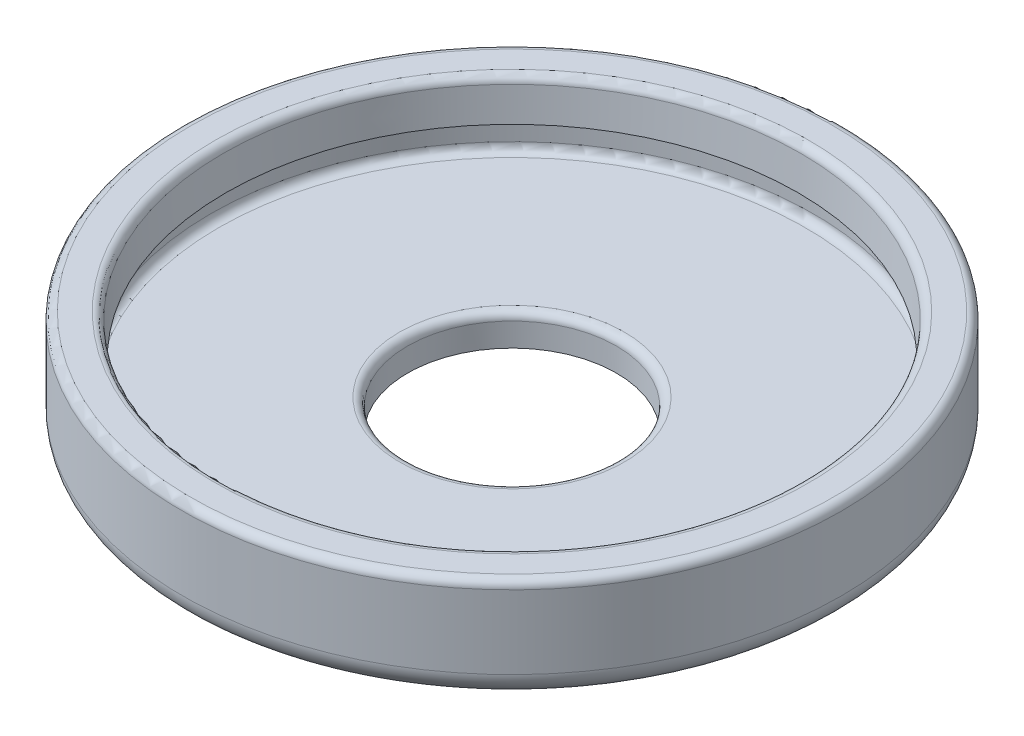
ISO-10303-21;
HEADER;
FILE_DESCRIPTION(('STEP AP214'),'2;1');
FILE_NAME('part.step','',(''),(''),'','','');
FILE_SCHEMA(('AUTOMOTIVE_DESIGN { 1 0 10303 214 1 1 1 1 }'));
ENDSEC;
DATA;
#1=APPLICATION_CONTEXT('core data for automotive mechanical design processes');
#2=APPLICATION_PROTOCOL_DEFINITION('international standard','automotive_design',2000,#1);
#3=PRODUCT_CONTEXT('',#1,'mechanical');
#4=PRODUCT('Part','Part','',(#3));
#5=PRODUCT_RELATED_PRODUCT_CATEGORY('part','',(#4));
#6=PRODUCT_DEFINITION_FORMATION('','',#4);
#7=PRODUCT_DEFINITION_CONTEXT('part definition',#1,'design');
#8=PRODUCT_DEFINITION('design','',#6,#7);
#9=PRODUCT_DEFINITION_SHAPE('','',#8);
#10=(LENGTH_UNIT() NAMED_UNIT(*) SI_UNIT(.MILLI.,.METRE.));
#11=(NAMED_UNIT(*) PLANE_ANGLE_UNIT() SI_UNIT($,.RADIAN.));
#12=(NAMED_UNIT(*) SI_UNIT($,.STERADIAN.) SOLID_ANGLE_UNIT());
#13=UNCERTAINTY_MEASURE_WITH_UNIT(LENGTH_MEASURE(1.E-05),#10,'distance_accuracy_value','');
#14=(GEOMETRIC_REPRESENTATION_CONTEXT(3) GLOBAL_UNCERTAINTY_ASSIGNED_CONTEXT((#13)) GLOBAL_UNIT_ASSIGNED_CONTEXT((#10,
#11,#12)) REPRESENTATION_CONTEXT('',''));
#15=CARTESIAN_POINT('',(0.,0.,0.));
#16=DIRECTION('',(0.,0.,1.));
#17=DIRECTION('',(1.,0.,0.));
#18=AXIS2_PLACEMENT_3D('',#15,#16,#17);
#19=CARTESIAN_POINT('',(1.17388042845035E-13,-34.2214349113332,0.));
#20=DIRECTION('',(0.,-1.,0.));
#21=DIRECTION('',(1.,0.,0.));
#22=AXIS2_PLACEMENT_3D('',#19,#20,#21);
#23=CYLINDRICAL_SURFACE('',#22,1.651);
#24=CARTESIAN_POINT('',(0.,0.370479819761335,0.));
#25=DIRECTION('',(0.,1.,0.));
#26=DIRECTION('',(-1.,0.,0.));
#27=AXIS2_PLACEMENT_3D('',#24,#25,#26);
#28=CIRCLE('',#27,1.651);
#29=CARTESIAN_POINT('',(-1.651,0.370479819761329,0.));
#30=VERTEX_POINT('',#29);
#31=EDGE_CURVE('E61',#30,#30,#28,.T.);
#32=ORIENTED_EDGE('',*,*,#31,.T.);
#33=EDGE_LOOP('',(#32));
#34=FACE_BOUND('',#33,.T.);
#35=CARTESIAN_POINT('',(0.,0.,0.));
#36=DIRECTION('',(0.,-1.,0.));
#37=DIRECTION('',(1.,0.,0.));
#38=AXIS2_PLACEMENT_3D('',#35,#36,#37);
#39=CIRCLE('',#38,1.651);
#40=CARTESIAN_POINT('',(1.651,0.,0.));
#41=VERTEX_POINT('',#40);
#42=EDGE_CURVE('E79',#41,#41,#39,.T.);
#43=ORIENTED_EDGE('',*,*,#42,.T.);
#44=EDGE_LOOP('',(#43));
#45=FACE_BOUND('',#44,.T.);
#46=ADVANCED_FACE('F41',(#34,#45),#23,.F.);
#47=CARTESIAN_POINT('',(1.651,0.,0.));
#48=DIRECTION('',(0.,-1.,0.));
#49=DIRECTION('',(1.,0.,0.));
#50=AXIS2_PLACEMENT_3D('',#47,#48,#49);
#51=PLANE('',#50);
#52=CARTESIAN_POINT('',(0.,0.,0.));
#53=DIRECTION('',(0.,-1.,0.));
#54=DIRECTION('',(1.,0.,0.));
#55=AXIS2_PLACEMENT_3D('',#52,#53,#54);
#56=CIRCLE('',#55,4.826);
#57=CARTESIAN_POINT('',(4.826,0.,0.));
#58=VERTEX_POINT('',#57);
#59=EDGE_CURVE('E76',#58,#58,#56,.T.);
#60=ORIENTED_EDGE('',*,*,#59,.T.);
#61=EDGE_LOOP('',(#60));
#62=FACE_BOUND('',#61,.T.);
#63=ORIENTED_EDGE('',*,*,#42,.F.);
#64=EDGE_LOOP('',(#63));
#65=FACE_BOUND('',#64,.T.);
#66=ADVANCED_FACE('F108',(#62,#65),#51,.T.);
#67=CARTESIAN_POINT('',(1.17388042845035E-13,-34.2214349113332,0.));
#68=DIRECTION('',(0.,-1.,0.));
#69=DIRECTION('',(1.,0.,0.));
#70=AXIS2_PLACEMENT_3D('',#67,#68,#69);
#71=CYLINDRICAL_SURFACE('',#70,5.207);
#72=CARTESIAN_POINT('',(0.,1.54063476070494,0.));
#73=DIRECTION('',(0.,1.,0.));
#74=DIRECTION('',(-1.,0.,0.));
#75=AXIS2_PLACEMENT_3D('',#72,#73,#74);
#76=CIRCLE('',#75,5.207);
#77=CARTESIAN_POINT('',(-5.20700000000001,1.54063476070492,0.));
#78=VERTEX_POINT('',#77);
#79=EDGE_CURVE('E10',#78,#78,#76,.F.);
#80=ORIENTED_EDGE('',*,*,#79,.T.);
#81=EDGE_LOOP('',(#80));
#82=FACE_BOUND('',#81,.T.);
#83=CARTESIAN_POINT('',(0.,0.380999999999986,0.));
#84=DIRECTION('',(0.,-1.,0.));
#85=DIRECTION('',(1.,0.,0.));
#86=AXIS2_PLACEMENT_3D('',#83,#84,#85);
#87=CIRCLE('',#86,5.207);
#88=CARTESIAN_POINT('',(5.207,0.381000000000003,0.));
#89=VERTEX_POINT('',#88);
#90=EDGE_CURVE('E73',#89,#89,#87,.F.);
#91=ORIENTED_EDGE('',*,*,#90,.T.);
#92=EDGE_LOOP('',(#91));
#93=FACE_BOUND('',#92,.T.);
#94=ADVANCED_FACE('F116',(#82,#93),#71,.T.);
#95=CARTESIAN_POINT('',(5.207,1.66763476070495,0.));
#96=DIRECTION('',(0.,1.,0.));
#97=DIRECTION('',(-1.,0.,0.));
#98=AXIS2_PLACEMENT_3D('',#95,#96,#97);
#99=PLANE('',#98);
#100=CARTESIAN_POINT('',(0.,1.66763476070494,0.));
#101=DIRECTION('',(0.,1.,0.));
#102=DIRECTION('',(-1.,0.,0.));
#103=AXIS2_PLACEMENT_3D('',#100,#101,#102);
#104=CIRCLE('',#103,4.68924575183249);
#105=CARTESIAN_POINT('',(-4.68924575183249,1.66763476070492,0.));
#106=VERTEX_POINT('',#105);
#107=EDGE_CURVE('E52',#106,#106,#104,.F.);
#108=ORIENTED_EDGE('',*,*,#107,.T.);
#109=EDGE_LOOP('',(#108));
#110=FACE_BOUND('',#109,.T.);
#111=CARTESIAN_POINT('',(0.,1.66763476070494,0.));
#112=DIRECTION('',(0.,1.,0.));
#113=DIRECTION('',(-1.,0.,0.));
#114=AXIS2_PLACEMENT_3D('',#111,#112,#113);
#115=CIRCLE('',#114,5.08);
#116=CARTESIAN_POINT('',(-5.08000000000001,1.66763476070492,0.));
#117=VERTEX_POINT('',#116);
#118=EDGE_CURVE('E56',#117,#117,#115,.T.);
#119=ORIENTED_EDGE('',*,*,#118,.T.);
#120=EDGE_LOOP('',(#119));
#121=FACE_BOUND('',#120,.T.);
#122=ADVANCED_FACE('F141',(#110,#121),#99,.T.);
#123=CARTESIAN_POINT('',(0.,1.66763476070494,0.));
#124=DIRECTION('',(0.,1.,0.));
#125=DIRECTION('',(-1.,0.,0.));
#126=AXIS2_PLACEMENT_3D('',#123,#124,#125);
#127=CONICAL_SURFACE('',#126,4.57200000000001,0.079829985712242);
#128=CARTESIAN_POINT('',(0.,1.55076240393486,0.));
#129=DIRECTION('',(0.,-1.,0.));
#130=DIRECTION('',(1.,0.,0.));
#131=AXIS2_PLACEMENT_3D('',#128,#129,#130);
#132=CIRCLE('',#131,4.5626502114584);
#133=CARTESIAN_POINT('',(4.56265021145839,1.55076240393488,0.));
#134=VERTEX_POINT('',#133);
#135=EDGE_CURVE('E48',#134,#134,#132,.F.);
#136=ORIENTED_EDGE('',*,*,#135,.T.);
#137=EDGE_LOOP('',(#136));
#138=FACE_BOUND('',#137,.T.);
#139=CARTESIAN_POINT('',(0.,1.03263476070494,0.));
#140=DIRECTION('',(0.,-1.,0.));
#141=DIRECTION('',(1.,0.,0.));
#142=AXIS2_PLACEMENT_3D('',#139,#140,#141);
#143=CIRCLE('',#142,4.5212);
#144=CARTESIAN_POINT('',(4.5212,1.03263476070496,0.));
#145=VERTEX_POINT('',#144);
#146=EDGE_CURVE('E82',#145,#145,#143,.T.);
#147=ORIENTED_EDGE('',*,*,#146,.T.);
#148=EDGE_LOOP('',(#147));
#149=FACE_BOUND('',#148,.T.);
#150=ADVANCED_FACE('F105',(#138,#149),#127,.F.);
#151=CARTESIAN_POINT('',(4.5212,1.03263476070495,0.));
#152=DIRECTION('',(0.,-1.,0.));
#153=DIRECTION('',(1.,0.,0.));
#154=AXIS2_PLACEMENT_3D('',#151,#152,#153);
#155=PLANE('',#154);
#156=CARTESIAN_POINT('',(0.,1.03263476070494,0.));
#157=DIRECTION('',(0.,-1.,0.));
#158=DIRECTION('',(1.,0.,0.));
#159=AXIS2_PLACEMENT_3D('',#156,#157,#158);
#160=CIRCLE('',#159,4.7625);
#161=CARTESIAN_POINT('',(4.7625,1.03263476070496,0.));
#162=VERTEX_POINT('',#161);
#163=EDGE_CURVE('E85',#162,#162,#160,.T.);
#164=ORIENTED_EDGE('',*,*,#163,.T.);
#165=EDGE_LOOP('',(#164));
#166=FACE_BOUND('',#165,.T.);
#167=ORIENTED_EDGE('',*,*,#146,.F.);
#168=EDGE_LOOP('',(#167));
#169=FACE_BOUND('',#168,.T.);
#170=ADVANCED_FACE('F89',(#166,#169),#155,.T.);
#171=CARTESIAN_POINT('',(1.17388042845035E-13,-34.2214349113332,0.));
#172=DIRECTION('',(0.,-1.,0.));
#173=DIRECTION('',(1.,0.,0.));
#174=AXIS2_PLACEMENT_3D('',#171,#172,#173);
#175=CYLINDRICAL_SURFACE('',#174,4.7625);
#176=CARTESIAN_POINT('',(0.,0.624479819761339,0.));
#177=DIRECTION('',(0.,1.,0.));
#178=DIRECTION('',(-1.,0.,0.));
#179=AXIS2_PLACEMENT_3D('',#176,#177,#178);
#180=CIRCLE('',#179,4.7625);
#181=CARTESIAN_POINT('',(-4.7625,0.624479819761323,0.));
#182=VERTEX_POINT('',#181);
#183=EDGE_CURVE('E70',#182,#182,#180,.F.);
#184=ORIENTED_EDGE('',*,*,#183,.T.);
#185=EDGE_LOOP('',(#184));
#186=FACE_BOUND('',#185,.T.);
#187=ORIENTED_EDGE('',*,*,#163,.F.);
#188=EDGE_LOOP('',(#187));
#189=FACE_BOUND('',#188,.T.);
#190=ADVANCED_FACE('F92',(#186,#189),#175,.F.);
#191=CARTESIAN_POINT('',(4.7625,0.497479819761352,0.));
#192=DIRECTION('',(0.,1.,0.));
#193=DIRECTION('',(-1.,0.,0.));
#194=AXIS2_PLACEMENT_3D('',#191,#192,#193);
#195=PLANE('',#194);
#196=CARTESIAN_POINT('',(0.,0.497479819761336,0.));
#197=DIRECTION('',(0.,1.,0.));
#198=DIRECTION('',(-1.,0.,0.));
#199=AXIS2_PLACEMENT_3D('',#196,#197,#198);
#200=CIRCLE('',#199,4.6355);
#201=CARTESIAN_POINT('',(-4.6355,0.49747981976132,0.));
#202=VERTEX_POINT('',#201);
#203=EDGE_CURVE('E64',#202,#202,#200,.T.);
#204=ORIENTED_EDGE('',*,*,#203,.T.);
#205=EDGE_LOOP('',(#204));
#206=FACE_BOUND('',#205,.T.);
#207=CARTESIAN_POINT('',(0.,0.497479819761336,0.));
#208=DIRECTION('',(0.,1.,0.));
#209=DIRECTION('',(-1.,0.,0.));
#210=AXIS2_PLACEMENT_3D('',#207,#208,#209);
#211=CIRCLE('',#210,1.778);
#212=CARTESIAN_POINT('',(-1.778,0.49747981976133,0.));
#213=VERTEX_POINT('',#212);
#214=EDGE_CURVE('E67',#213,#213,#211,.F.);
#215=ORIENTED_EDGE('',*,*,#214,.T.);
#216=EDGE_LOOP('',(#215));
#217=FACE_BOUND('',#216,.T.);
#218=ADVANCED_FACE('F94',(#206,#217),#195,.T.);
#219=CARTESIAN_POINT('',(0.,0.380999999999986,0.));
#220=DIRECTION('',(0.,-1.,0.));
#221=DIRECTION('',(1.,0.,0.));
#222=AXIS2_PLACEMENT_3D('',#219,#220,#221);
#223=TOROIDAL_SURFACE('',#222,4.826,0.381);
#224=ORIENTED_EDGE('',*,*,#90,.F.);
#225=EDGE_LOOP('',(#224));
#226=FACE_BOUND('',#225,.T.);
#227=ORIENTED_EDGE('',*,*,#59,.F.);
#228=EDGE_LOOP('',(#227));
#229=FACE_BOUND('',#228,.T.);
#230=ADVANCED_FACE('F101',(#226,#229),#223,.T.);
#231=CARTESIAN_POINT('',(0.,0.624479819761339,0.));
#232=DIRECTION('',(0.,1.,0.));
#233=DIRECTION('',(-1.,0.,0.));
#234=AXIS2_PLACEMENT_3D('',#231,#232,#233);
#235=TOROIDAL_SURFACE('',#234,4.6355,0.127);
#236=ORIENTED_EDGE('',*,*,#203,.F.);
#237=EDGE_LOOP('',(#236));
#238=FACE_BOUND('',#237,.T.);
#239=ORIENTED_EDGE('',*,*,#183,.F.);
#240=EDGE_LOOP('',(#239));
#241=FACE_BOUND('',#240,.T.);
#242=ADVANCED_FACE('F123',(#238,#241),#235,.F.);
#243=CARTESIAN_POINT('',(0.,0.370479819761335,0.));
#244=DIRECTION('',(0.,1.,0.));
#245=DIRECTION('',(-1.,0.,0.));
#246=AXIS2_PLACEMENT_3D('',#243,#244,#245);
#247=TOROIDAL_SURFACE('',#246,1.778,0.127);
#248=ORIENTED_EDGE('',*,*,#31,.F.);
#249=EDGE_LOOP('',(#248));
#250=FACE_BOUND('',#249,.T.);
#251=ORIENTED_EDGE('',*,*,#214,.F.);
#252=EDGE_LOOP('',(#251));
#253=FACE_BOUND('',#252,.T.);
#254=ADVANCED_FACE('F127',(#250,#253),#247,.T.);
#255=CARTESIAN_POINT('',(0.,1.54063476070494,0.));
#256=DIRECTION('',(0.,1.,0.));
#257=DIRECTION('',(-1.,0.,0.));
#258=AXIS2_PLACEMENT_3D('',#255,#256,#257);
#259=TOROIDAL_SURFACE('',#258,4.68924575183249,0.127);
#260=ORIENTED_EDGE('',*,*,#135,.F.);
#261=EDGE_LOOP('',(#260));
#262=FACE_BOUND('',#261,.T.);
#263=ORIENTED_EDGE('',*,*,#107,.F.);
#264=EDGE_LOOP('',(#263));
#265=FACE_BOUND('',#264,.T.);
#266=ADVANCED_FACE('F130',(#262,#265),#259,.T.);
#267=CARTESIAN_POINT('',(0.,1.54063476070494,0.));
#268=DIRECTION('',(0.,1.,0.));
#269=DIRECTION('',(-1.,0.,0.));
#270=AXIS2_PLACEMENT_3D('',#267,#268,#269);
#271=TOROIDAL_SURFACE('',#270,5.08,0.127);
#272=ORIENTED_EDGE('',*,*,#118,.F.);
#273=EDGE_LOOP('',(#272));
#274=FACE_BOUND('',#273,.T.);
#275=ORIENTED_EDGE('',*,*,#79,.F.);
#276=EDGE_LOOP('',(#275));
#277=FACE_BOUND('',#276,.T.);
#278=ADVANCED_FACE('F43',(#274,#277),#271,.T.);
#279=CLOSED_SHELL('',(#46,#66,#94,#122,#150,#170,#190,#218,#230,#242,#254,#266,#278));
#280=MANIFOLD_SOLID_BREP('B2',#279);
#281=ADVANCED_BREP_SHAPE_REPRESENTATION('',(#18,#280),#14);
#282=SHAPE_DEFINITION_REPRESENTATION(#9,#281);
ENDSEC;
END-ISO-10303-21;
